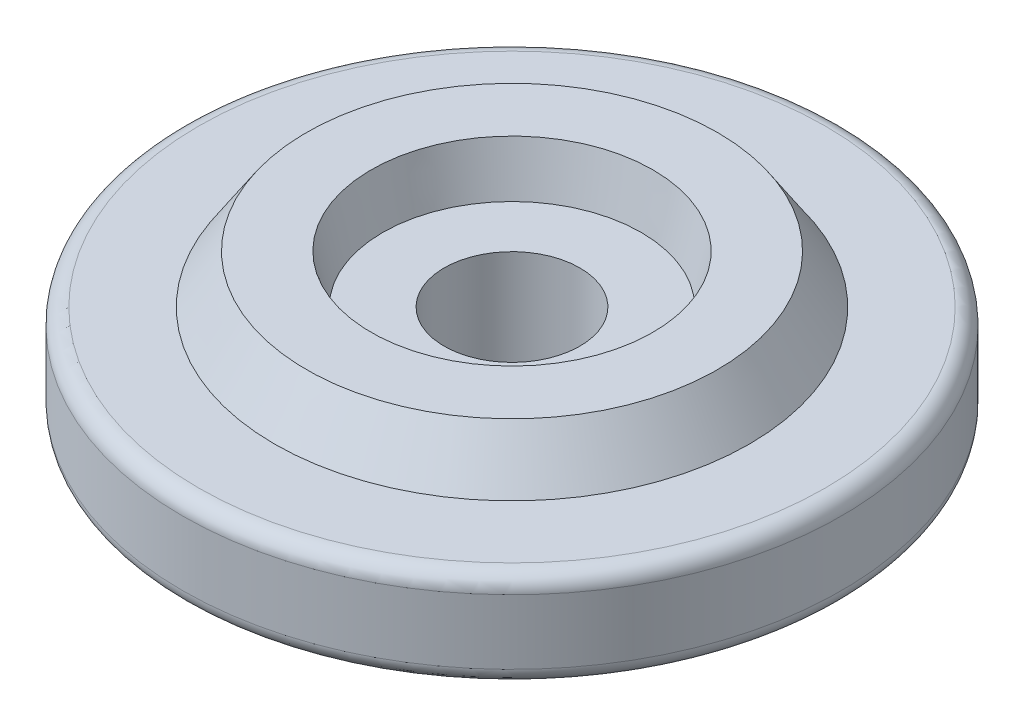
ISO-10303-21;
HEADER;
FILE_DESCRIPTION(('STEP AP214'),'2;1');
FILE_NAME('part.step','',(''),(''),'','','');
FILE_SCHEMA(('AUTOMOTIVE_DESIGN { 1 0 10303 214 1 1 1 1 }'));
ENDSEC;
DATA;
#1=APPLICATION_CONTEXT('core data for automotive mechanical design processes');
#2=APPLICATION_PROTOCOL_DEFINITION('international standard','automotive_design',2000,#1);
#3=PRODUCT_CONTEXT('',#1,'mechanical');
#4=PRODUCT('Part','Part','',(#3));
#5=PRODUCT_RELATED_PRODUCT_CATEGORY('part','',(#4));
#6=PRODUCT_DEFINITION_FORMATION('','',#4);
#7=PRODUCT_DEFINITION_CONTEXT('part definition',#1,'design');
#8=PRODUCT_DEFINITION('design','',#6,#7);
#9=PRODUCT_DEFINITION_SHAPE('','',#8);
#10=(LENGTH_UNIT() NAMED_UNIT(*) SI_UNIT(.MILLI.,.METRE.));
#11=(NAMED_UNIT(*) PLANE_ANGLE_UNIT() SI_UNIT($,.RADIAN.));
#12=(NAMED_UNIT(*) SI_UNIT($,.STERADIAN.) SOLID_ANGLE_UNIT());
#13=UNCERTAINTY_MEASURE_WITH_UNIT(LENGTH_MEASURE(1.E-05),#10,'distance_accuracy_value','');
#14=(GEOMETRIC_REPRESENTATION_CONTEXT(3) GLOBAL_UNCERTAINTY_ASSIGNED_CONTEXT((#13)) GLOBAL_UNIT_ASSIGNED_CONTEXT((#10,
#11,#12)) REPRESENTATION_CONTEXT('',''));
#15=CARTESIAN_POINT('',(0.,0.,0.));
#16=DIRECTION('',(0.,0.,1.));
#17=DIRECTION('',(1.,0.,0.));
#18=AXIS2_PLACEMENT_3D('',#15,#16,#17);
#19=CARTESIAN_POINT('',(9.7,0.,0.));
#20=DIRECTION('',(0.,-1.,0.));
#21=DIRECTION('',(0.,0.,-1.));
#22=AXIS2_PLACEMENT_3D('',#19,#20,#21);
#23=PLANE('',#22);
#24=CARTESIAN_POINT('',(0.,0.,0.));
#25=DIRECTION('',(0.,-1.,0.));
#26=DIRECTION('',(0.,0.,-1.));
#27=AXIS2_PLACEMENT_3D('',#24,#25,#26);
#28=CIRCLE('',#27,9.7);
#29=CARTESIAN_POINT('',(0.,0.,-9.7));
#30=VERTEX_POINT('',#29);
#31=EDGE_CURVE('E65',#30,#30,#28,.T.);
#32=ORIENTED_EDGE('',*,*,#31,.T.);
#33=EDGE_LOOP('',(#32));
#34=FACE_BOUND('',#33,.T.);
#35=CARTESIAN_POINT('',(0.,0.,0.));
#36=DIRECTION('',(0.,-1.,0.));
#37=DIRECTION('',(0.,0.,-1.));
#38=AXIS2_PLACEMENT_3D('',#35,#36,#37);
#39=CIRCLE('',#38,2.1);
#40=CARTESIAN_POINT('',(0.,0.,-2.1));
#41=VERTEX_POINT('',#40);
#42=EDGE_CURVE('E10',#41,#41,#39,.T.);
#43=ORIENTED_EDGE('',*,*,#42,.F.);
#44=EDGE_LOOP('',(#43));
#45=FACE_BOUND('',#44,.T.);
#46=ADVANCED_FACE('F31',(#34,#45),#23,.T.);
#47=CARTESIAN_POINT('',(0.,0.,0.));
#48=DIRECTION('',(0.,-1.,0.));
#49=DIRECTION('',(0.,0.,-1.));
#50=AXIS2_PLACEMENT_3D('',#47,#48,#49);
#51=CYLINDRICAL_SURFACE('',#50,2.1);
#52=ORIENTED_EDGE('',*,*,#42,.T.);
#53=EDGE_LOOP('',(#52));
#54=FACE_BOUND('',#53,.T.);
#55=CARTESIAN_POINT('',(0.,3.,0.));
#56=DIRECTION('',(0.,-1.,0.));
#57=DIRECTION('',(0.,0.,-1.));
#58=AXIS2_PLACEMENT_3D('',#55,#56,#57);
#59=CIRCLE('',#58,2.1);
#60=CARTESIAN_POINT('',(0.,3.,-2.1));
#61=VERTEX_POINT('',#60);
#62=EDGE_CURVE('E37',#61,#61,#59,.T.);
#63=ORIENTED_EDGE('',*,*,#62,.F.);
#64=EDGE_LOOP('',(#63));
#65=FACE_BOUND('',#64,.T.);
#66=ADVANCED_FACE('F83',(#54,#65),#51,.F.);
#67=CARTESIAN_POINT('',(2.1,3.,0.));
#68=DIRECTION('',(0.,1.,0.));
#69=DIRECTION('',(0.,0.,1.));
#70=AXIS2_PLACEMENT_3D('',#67,#68,#69);
#71=PLANE('',#70);
#72=ORIENTED_EDGE('',*,*,#62,.T.);
#73=EDGE_LOOP('',(#72));
#74=FACE_BOUND('',#73,.T.);
#75=CARTESIAN_POINT('',(0.,3.,0.));
#76=DIRECTION('',(0.,-1.,0.));
#77=DIRECTION('',(0.,0.,-1.));
#78=AXIS2_PLACEMENT_3D('',#75,#76,#77);
#79=CIRCLE('',#78,4.);
#80=CARTESIAN_POINT('',(0.,3.,-4.));
#81=VERTEX_POINT('',#80);
#82=EDGE_CURVE('E41',#81,#81,#79,.T.);
#83=ORIENTED_EDGE('',*,*,#82,.F.);
#84=EDGE_LOOP('',(#83));
#85=FACE_BOUND('',#84,.T.);
#86=ADVANCED_FACE('F87',(#74,#85),#71,.T.);
#87=CARTESIAN_POINT('',(0.,4.5,0.));
#88=DIRECTION('',(0.,1.,0.));
#89=DIRECTION('',(0.,0.,1.));
#90=AXIS2_PLACEMENT_3D('',#87,#88,#89);
#91=CONICAL_SURFACE('',#90,4.35936974634003,0.235147657393655);
#92=ORIENTED_EDGE('',*,*,#82,.T.);
#93=EDGE_LOOP('',(#92));
#94=FACE_BOUND('',#93,.T.);
#95=CARTESIAN_POINT('',(0.,4.5,0.));
#96=DIRECTION('',(0.,-1.,0.));
#97=DIRECTION('',(0.,0.,-1.));
#98=AXIS2_PLACEMENT_3D('',#95,#96,#97);
#99=CIRCLE('',#98,4.35936974634003);
#100=CARTESIAN_POINT('',(0.,4.5,-4.35936974634003));
#101=VERTEX_POINT('',#100);
#102=EDGE_CURVE('E45',#101,#101,#99,.T.);
#103=ORIENTED_EDGE('',*,*,#102,.F.);
#104=EDGE_LOOP('',(#103));
#105=FACE_BOUND('',#104,.T.);
#106=ADVANCED_FACE('F91',(#94,#105),#91,.F.);
#107=CARTESIAN_POINT('',(4.35936974634003,4.5,0.));
#108=DIRECTION('',(0.,1.,0.));
#109=DIRECTION('',(0.,0.,1.));
#110=AXIS2_PLACEMENT_3D('',#107,#108,#109);
#111=PLANE('',#110);
#112=ORIENTED_EDGE('',*,*,#102,.T.);
#113=EDGE_LOOP('',(#112));
#114=FACE_BOUND('',#113,.T.);
#115=CARTESIAN_POINT('',(0.,4.5,0.));
#116=DIRECTION('',(0.,-1.,0.));
#117=DIRECTION('',(0.,0.,-1.));
#118=AXIS2_PLACEMENT_3D('',#115,#116,#117);
#119=CIRCLE('',#118,6.35936974634003);
#120=CARTESIAN_POINT('',(0.,4.5,-6.35936974634003));
#121=VERTEX_POINT('',#120);
#122=EDGE_CURVE('E50',#121,#121,#119,.T.);
#123=ORIENTED_EDGE('',*,*,#122,.F.);
#124=EDGE_LOOP('',(#123));
#125=FACE_BOUND('',#124,.T.);
#126=ADVANCED_FACE('F97',(#114,#125),#111,.T.);
#127=CARTESIAN_POINT('',(0.,3.,0.));
#128=DIRECTION('',(0.,-1.,0.));
#129=DIRECTION('',(0.,0.,-1.));
#130=AXIS2_PLACEMENT_3D('',#127,#128,#129);
#131=CONICAL_SURFACE('',#130,7.34798703523683,0.582730628828878);
#132=ORIENTED_EDGE('',*,*,#122,.T.);
#133=EDGE_LOOP('',(#132));
#134=FACE_BOUND('',#133,.T.);
#135=CARTESIAN_POINT('',(0.,3.,0.));
#136=DIRECTION('',(0.,-1.,0.));
#137=DIRECTION('',(0.,0.,-1.));
#138=AXIS2_PLACEMENT_3D('',#135,#136,#137);
#139=CIRCLE('',#138,7.34798703523683);
#140=CARTESIAN_POINT('',(0.,3.,-7.34798703523683));
#141=VERTEX_POINT('',#140);
#142=EDGE_CURVE('E53',#141,#141,#139,.T.);
#143=ORIENTED_EDGE('',*,*,#142,.F.);
#144=EDGE_LOOP('',(#143));
#145=FACE_BOUND('',#144,.T.);
#146=ADVANCED_FACE('F101',(#134,#145),#131,.T.);
#147=CARTESIAN_POINT('',(7.34798703523683,3.,0.));
#148=DIRECTION('',(0.,1.,0.));
#149=DIRECTION('',(0.,0.,1.));
#150=AXIS2_PLACEMENT_3D('',#147,#148,#149);
#151=PLANE('',#150);
#152=ORIENTED_EDGE('',*,*,#142,.T.);
#153=EDGE_LOOP('',(#152));
#154=FACE_BOUND('',#153,.T.);
#155=CARTESIAN_POINT('',(0.,3.,0.));
#156=DIRECTION('',(0.,-1.,0.));
#157=DIRECTION('',(0.,0.,-1.));
#158=AXIS2_PLACEMENT_3D('',#155,#156,#157);
#159=CIRCLE('',#158,9.7);
#160=CARTESIAN_POINT('',(0.,3.,-9.7));
#161=VERTEX_POINT('',#160);
#162=EDGE_CURVE('E56',#161,#161,#159,.T.);
#163=ORIENTED_EDGE('',*,*,#162,.F.);
#164=EDGE_LOOP('',(#163));
#165=FACE_BOUND('',#164,.T.);
#166=ADVANCED_FACE('F105',(#154,#165),#151,.T.);
#167=CARTESIAN_POINT('',(0.,2.5,0.));
#168=DIRECTION('',(0.,-1.,0.));
#169=DIRECTION('',(0.,0.,-1.));
#170=AXIS2_PLACEMENT_3D('',#167,#168,#169);
#171=TOROIDAL_SURFACE('',#170,9.7,0.5);
#172=ORIENTED_EDGE('',*,*,#162,.T.);
#173=EDGE_LOOP('',(#172));
#174=FACE_BOUND('',#173,.T.);
#175=CARTESIAN_POINT('',(0.,2.5,0.));
#176=DIRECTION('',(0.,-1.,0.));
#177=DIRECTION('',(0.,0.,-1.));
#178=AXIS2_PLACEMENT_3D('',#175,#176,#177);
#179=CIRCLE('',#178,10.2);
#180=CARTESIAN_POINT('',(0.,2.5,-10.2));
#181=VERTEX_POINT('',#180);
#182=EDGE_CURVE('E59',#181,#181,#179,.T.);
#183=ORIENTED_EDGE('',*,*,#182,.F.);
#184=EDGE_LOOP('',(#183));
#185=FACE_BOUND('',#184,.T.);
#186=ADVANCED_FACE('F79',(#174,#185),#171,.T.);
#187=CARTESIAN_POINT('',(0.,0.,0.));
#188=DIRECTION('',(0.,-1.,0.));
#189=DIRECTION('',(0.,0.,-1.));
#190=AXIS2_PLACEMENT_3D('',#187,#188,#189);
#191=CYLINDRICAL_SURFACE('',#190,10.2);
#192=ORIENTED_EDGE('',*,*,#182,.T.);
#193=EDGE_LOOP('',(#192));
#194=FACE_BOUND('',#193,.T.);
#195=CARTESIAN_POINT('',(0.,0.500000000000003,0.));
#196=DIRECTION('',(0.,-1.,0.));
#197=DIRECTION('',(0.,0.,-1.));
#198=AXIS2_PLACEMENT_3D('',#195,#196,#197);
#199=CIRCLE('',#198,10.2);
#200=CARTESIAN_POINT('',(0.,0.500000000000003,-10.2));
#201=VERTEX_POINT('',#200);
#202=EDGE_CURVE('E62',#201,#201,#199,.T.);
#203=ORIENTED_EDGE('',*,*,#202,.F.);
#204=EDGE_LOOP('',(#203));
#205=FACE_BOUND('',#204,.T.);
#206=ADVANCED_FACE('F73',(#194,#205),#191,.T.);
#207=CARTESIAN_POINT('',(0.,0.5,0.));
#208=DIRECTION('',(0.,-1.,0.));
#209=DIRECTION('',(0.,0.,-1.));
#210=AXIS2_PLACEMENT_3D('',#207,#208,#209);
#211=TOROIDAL_SURFACE('',#210,9.7,0.5);
#212=ORIENTED_EDGE('',*,*,#202,.T.);
#213=EDGE_LOOP('',(#212));
#214=FACE_BOUND('',#213,.T.);
#215=ORIENTED_EDGE('',*,*,#31,.F.);
#216=EDGE_LOOP('',(#215));
#217=FACE_BOUND('',#216,.T.);
#218=ADVANCED_FACE('F71',(#214,#217),#211,.T.);
#219=CLOSED_SHELL('',(#46,#66,#86,#106,#126,#146,#166,#186,#206,#218));
#220=MANIFOLD_SOLID_BREP('B2',#219);
#221=ADVANCED_BREP_SHAPE_REPRESENTATION('',(#18,#220),#14);
#222=SHAPE_DEFINITION_REPRESENTATION(#9,#221);
ENDSEC;
END-ISO-10303-21;
